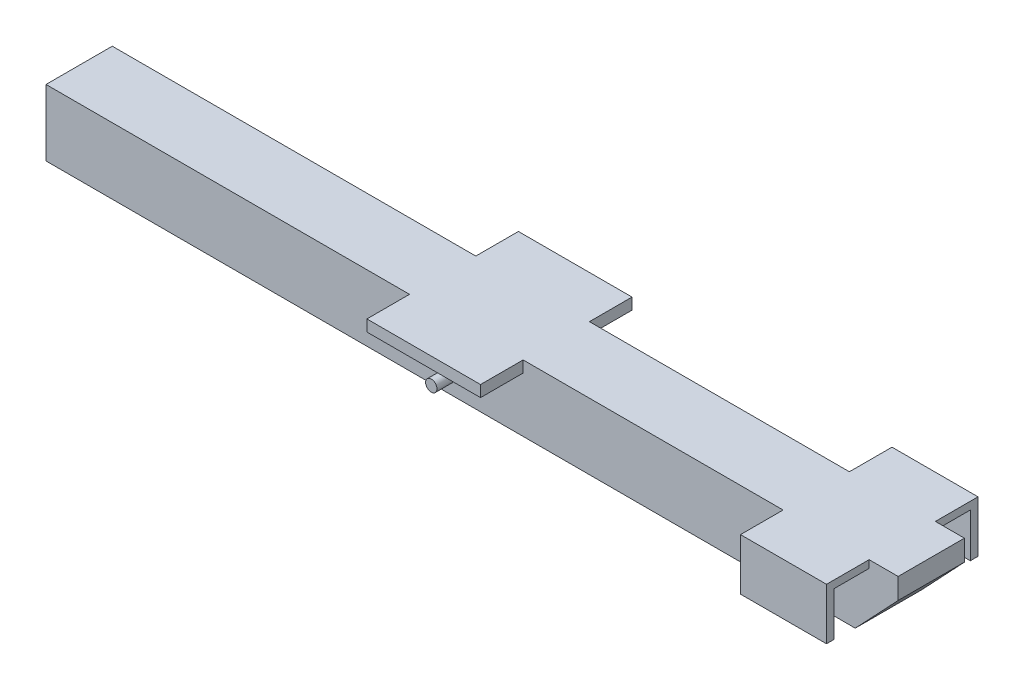
ISO-10303-21;
HEADER;
FILE_DESCRIPTION(('STEP AP214'),'2;1');
FILE_NAME('part.step','',(''),(''),'','','');
FILE_SCHEMA(('AUTOMOTIVE_DESIGN { 1 0 10303 214 1 1 1 1 }'));
ENDSEC;
DATA;
#1=APPLICATION_CONTEXT('core data for automotive mechanical design processes');
#2=APPLICATION_PROTOCOL_DEFINITION('international standard','automotive_design',2000,#1);
#3=PRODUCT_CONTEXT('',#1,'mechanical');
#4=PRODUCT('Part','Part','',(#3));
#5=PRODUCT_RELATED_PRODUCT_CATEGORY('part','',(#4));
#6=PRODUCT_DEFINITION_FORMATION('','',#4);
#7=PRODUCT_DEFINITION_CONTEXT('part definition',#1,'design');
#8=PRODUCT_DEFINITION('design','',#6,#7);
#9=PRODUCT_DEFINITION_SHAPE('','',#8);
#10=(LENGTH_UNIT() NAMED_UNIT(*) SI_UNIT(.MILLI.,.METRE.));
#11=(NAMED_UNIT(*) PLANE_ANGLE_UNIT() SI_UNIT($,.RADIAN.));
#12=(NAMED_UNIT(*) SI_UNIT($,.STERADIAN.) SOLID_ANGLE_UNIT());
#13=UNCERTAINTY_MEASURE_WITH_UNIT(LENGTH_MEASURE(1.E-05),#10,'distance_accuracy_value','');
#14=(GEOMETRIC_REPRESENTATION_CONTEXT(3) GLOBAL_UNCERTAINTY_ASSIGNED_CONTEXT((#13)) GLOBAL_UNIT_ASSIGNED_CONTEXT((#10,
#11,#12)) REPRESENTATION_CONTEXT('',''));
#15=CARTESIAN_POINT('',(0.,0.,0.));
#16=DIRECTION('',(0.,0.,1.));
#17=DIRECTION('',(1.,0.,0.));
#18=AXIS2_PLACEMENT_3D('',#15,#16,#17);
#19=CARTESIAN_POINT('',(11430.,609.6,889.));
#20=DIRECTION('',(-0.727272727272728,0.686348585024613,0.));
#21=DIRECTION('',(-0.686348585024613,-0.727272727272728,0.));
#22=AXIS2_PLACEMENT_3D('',#19,#20,#21);
#23=PLANE('',#22);
#24=DIRECTION('',(0.686348585024613,0.727272727272728,0.));
#25=VECTOR('',#24,1.);
#26=CARTESIAN_POINT('',(11430.,609.6,0.));
#27=LINE('',#26,#25);
#28=CARTESIAN_POINT('',(10854.7026160324,0.,0.));
#29=VERTEX_POINT('',#28);
#30=CARTESIAN_POINT('',(11430.,609.6,0.));
#31=VERTEX_POINT('',#30);
#32=EDGE_CURVE('E394',#29,#31,#27,.T.);
#33=ORIENTED_EDGE('',*,*,#32,.T.);
#34=DIRECTION('',(0.,0.,-1.));
#35=VECTOR('',#34,1.);
#36=CARTESIAN_POINT('',(11430.,609.6,889.));
#37=LINE('',#36,#35);
#38=CARTESIAN_POINT('',(11430.,609.6,889.));
#39=VERTEX_POINT('',#38);
#40=EDGE_CURVE('E432',#39,#31,#37,.T.);
#41=ORIENTED_EDGE('',*,*,#40,.F.);
#42=DIRECTION('',(0.686348585024613,0.727272727272728,0.));
#43=VECTOR('',#42,1.);
#44=CARTESIAN_POINT('',(11430.,609.6,889.));
#45=LINE('',#44,#43);
#46=CARTESIAN_POINT('',(10854.7026160324,0.,889.));
#47=VERTEX_POINT('',#46);
#48=EDGE_CURVE('E395',#47,#39,#45,.T.);
#49=ORIENTED_EDGE('',*,*,#48,.F.);
#50=DIRECTION('',(0.,0.,-1.));
#51=VECTOR('',#50,1.);
#52=CARTESIAN_POINT('',(10854.7026160324,0.,889.));
#53=LINE('',#52,#51);
#54=EDGE_CURVE('E409',#47,#29,#53,.T.);
#55=ORIENTED_EDGE('',*,*,#54,.T.);
#56=EDGE_LOOP('',(#33,#41,#49,#55));
#57=FACE_BOUND('',#56,.T.);
#58=ADVANCED_FACE('F33',(#57),#23,.F.);
#59=CARTESIAN_POINT('',(11430.,889.,889.));
#60=DIRECTION('',(-1.,0.,0.));
#61=DIRECTION('',(0.,0.,1.));
#62=AXIS2_PLACEMENT_3D('',#59,#60,#61);
#63=PLANE('',#62);
#64=DIRECTION('',(0.,1.,0.));
#65=VECTOR('',#64,1.);
#66=CARTESIAN_POINT('',(11430.,889.,0.));
#67=LINE('',#66,#65);
#68=CARTESIAN_POINT('',(11430.,889.,0.));
#69=VERTEX_POINT('',#68);
#70=EDGE_CURVE('E411',#31,#69,#67,.T.);
#71=ORIENTED_EDGE('',*,*,#70,.T.);
#72=DIRECTION('',(0.,0.,-1.));
#73=VECTOR('',#72,1.);
#74=CARTESIAN_POINT('',(11430.,889.,889.));
#75=LINE('',#74,#73);
#76=CARTESIAN_POINT('',(11430.,889.,889.));
#77=VERTEX_POINT('',#76);
#78=EDGE_CURVE('E429',#77,#69,#75,.T.);
#79=ORIENTED_EDGE('',*,*,#78,.F.);
#80=DIRECTION('',(0.,1.,0.));
#81=VECTOR('',#80,1.);
#82=CARTESIAN_POINT('',(11430.,889.,889.));
#83=LINE('',#82,#81);
#84=EDGE_CURVE('E397',#39,#77,#83,.T.);
#85=ORIENTED_EDGE('',*,*,#84,.F.);
#86=ORIENTED_EDGE('',*,*,#40,.T.);
#87=EDGE_LOOP('',(#71,#79,#85,#86));
#88=FACE_BOUND('',#87,.T.);
#89=ADVANCED_FACE('F478',(#88),#63,.F.);
#90=CARTESIAN_POINT('',(0.,889.,889.));
#91=DIRECTION('',(0.,-1.,0.));
#92=DIRECTION('',(0.,0.,-1.));
#93=AXIS2_PLACEMENT_3D('',#90,#91,#92);
#94=PLANE('',#93);
#95=DIRECTION('',(-1.,0.,0.));
#96=VECTOR('',#95,1.);
#97=CARTESIAN_POINT('',(0.,889.,889.));
#98=LINE('',#97,#96);
#99=CARTESIAN_POINT('',(4875.98464352882,888.999999999999,889.));
#100=VERTEX_POINT('',#99);
#101=CARTESIAN_POINT('',(0.,889.,889.));
#102=VERTEX_POINT('',#101);
#103=EDGE_CURVE('E400',#100,#102,#98,.T.);
#104=ORIENTED_EDGE('',*,*,#103,.F.);
#105=DIRECTION('',(0.,0.,1.));
#106=VECTOR('',#105,1.);
#107=CARTESIAN_POINT('',(4875.98464352882,888.999999999999,-571.5));
#108=LINE('',#107,#106);
#109=CARTESIAN_POINT('',(4875.98464352882,888.999999999999,1460.5));
#110=VERTEX_POINT('',#109);
#111=EDGE_CURVE('E339',#100,#110,#108,.T.);
#112=ORIENTED_EDGE('',*,*,#111,.T.);
#113=DIRECTION('',(-1.,0.,0.));
#114=VECTOR('',#113,1.);
#115=CARTESIAN_POINT('',(6399.98464352881,889.,1460.5));
#116=LINE('',#115,#114);
#117=CARTESIAN_POINT('',(6399.98464352881,889.,1460.5));
#118=VERTEX_POINT('',#117);
#119=EDGE_CURVE('E306',#118,#110,#116,.T.);
#120=ORIENTED_EDGE('',*,*,#119,.F.);
#121=DIRECTION('',(0.,0.,1.));
#122=VECTOR('',#121,1.);
#123=CARTESIAN_POINT('',(6399.98464352881,889.,-571.5));
#124=LINE('',#123,#122);
#125=CARTESIAN_POINT('',(6399.98464352881,889.,889.));
#126=VERTEX_POINT('',#125);
#127=EDGE_CURVE('E327',#126,#118,#124,.T.);
#128=ORIENTED_EDGE('',*,*,#127,.F.);
#129=CARTESIAN_POINT('',(9887.1332373752,889.,889.));
#130=VERTEX_POINT('',#129);
#131=EDGE_CURVE('E405',#130,#126,#98,.T.);
#132=ORIENTED_EDGE('',*,*,#131,.F.);
#133=DIRECTION('',(0.,0.,1.));
#134=VECTOR('',#133,1.);
#135=CARTESIAN_POINT('',(9887.1332373752,889.,-571.5));
#136=LINE('',#135,#134);
#137=CARTESIAN_POINT('',(9887.1332373752,889.,1460.5));
#138=VERTEX_POINT('',#137);
#139=EDGE_CURVE('E386',#130,#138,#136,.T.);
#140=ORIENTED_EDGE('',*,*,#139,.T.);
#141=DIRECTION('',(-1.,0.,0.));
#142=VECTOR('',#141,1.);
#143=CARTESIAN_POINT('',(11040.8360496824,889.,1460.5));
#144=LINE('',#143,#142);
#145=CARTESIAN_POINT('',(11040.8360496824,889.,1460.5));
#146=VERTEX_POINT('',#145);
#147=EDGE_CURVE('E353',#146,#138,#144,.T.);
#148=ORIENTED_EDGE('',*,*,#147,.F.);
#149=DIRECTION('',(0.,0.,1.));
#150=VECTOR('',#149,1.);
#151=CARTESIAN_POINT('',(11040.8360496824,889.,-571.5));
#152=LINE('',#151,#150);
#153=CARTESIAN_POINT('',(11040.8360496824,889.,889.));
#154=VERTEX_POINT('',#153);
#155=EDGE_CURVE('E374',#154,#146,#152,.T.);
#156=ORIENTED_EDGE('',*,*,#155,.F.);
#157=EDGE_CURVE('E401',#77,#154,#98,.T.);
#158=ORIENTED_EDGE('',*,*,#157,.F.);
#159=ORIENTED_EDGE('',*,*,#78,.T.);
#160=DIRECTION('',(-1.,0.,0.));
#161=VECTOR('',#160,1.);
#162=CARTESIAN_POINT('',(0.,889.,0.));
#163=LINE('',#162,#161);
#164=CARTESIAN_POINT('',(11040.8360496824,889.,0.));
#165=VERTEX_POINT('',#164);
#166=EDGE_CURVE('E414',#69,#165,#163,.T.);
#167=ORIENTED_EDGE('',*,*,#166,.T.);
#168=CARTESIAN_POINT('',(11040.8360496824,889.,-571.5));
#169=VERTEX_POINT('',#168);
#170=EDGE_CURVE('E387',#169,#165,#152,.T.);
#171=ORIENTED_EDGE('',*,*,#170,.F.);
#172=DIRECTION('',(-1.,0.,0.));
#173=VECTOR('',#172,1.);
#174=CARTESIAN_POINT('',(11040.8360496824,889.,-571.5));
#175=LINE('',#174,#173);
#176=CARTESIAN_POINT('',(9887.1332373752,889.,-571.5));
#177=VERTEX_POINT('',#176);
#178=EDGE_CURVE('E365',#169,#177,#175,.T.);
#179=ORIENTED_EDGE('',*,*,#178,.T.);
#180=CARTESIAN_POINT('',(9887.1332373752,889.,0.));
#181=VERTEX_POINT('',#180);
#182=EDGE_CURVE('E384',#177,#181,#136,.T.);
#183=ORIENTED_EDGE('',*,*,#182,.T.);
#184=CARTESIAN_POINT('',(6399.98464352881,889.,0.));
#185=VERTEX_POINT('',#184);
#186=EDGE_CURVE('E418',#181,#185,#163,.T.);
#187=ORIENTED_EDGE('',*,*,#186,.T.);
#188=CARTESIAN_POINT('',(6399.98464352881,889.,-571.5));
#189=VERTEX_POINT('',#188);
#190=EDGE_CURVE('E340',#189,#185,#124,.T.);
#191=ORIENTED_EDGE('',*,*,#190,.F.);
#192=DIRECTION('',(-1.,0.,0.));
#193=VECTOR('',#192,1.);
#194=CARTESIAN_POINT('',(6399.98464352881,889.,-571.5));
#195=LINE('',#194,#193);
#196=CARTESIAN_POINT('',(4875.98464352882,888.999999999999,-571.5));
#197=VERTEX_POINT('',#196);
#198=EDGE_CURVE('E318',#189,#197,#195,.T.);
#199=ORIENTED_EDGE('',*,*,#198,.T.);
#200=CARTESIAN_POINT('',(4875.98464352882,889.,0.));
#201=VERTEX_POINT('',#200);
#202=EDGE_CURVE('E337',#197,#201,#108,.T.);
#203=ORIENTED_EDGE('',*,*,#202,.T.);
#204=CARTESIAN_POINT('',(0.,889.,0.));
#205=VERTEX_POINT('',#204);
#206=EDGE_CURVE('E413',#201,#205,#163,.T.);
#207=ORIENTED_EDGE('',*,*,#206,.T.);
#208=DIRECTION('',(0.,0.,-1.));
#209=VECTOR('',#208,1.);
#210=CARTESIAN_POINT('',(0.,889.,889.));
#211=LINE('',#210,#209);
#212=EDGE_CURVE('E426',#102,#205,#211,.T.);
#213=ORIENTED_EDGE('',*,*,#212,.F.);
#214=EDGE_LOOP('',(#104,#112,#120,#128,#132,#140,#148,#156,#158,#159,#167,#171,#179,#183,#187,
#191,#199,#203,#207,#213));
#215=FACE_BOUND('',#214,.T.);
#216=ADVANCED_FACE('F452',(#215),#94,.F.);
#217=CARTESIAN_POINT('',(0.,889.,889.));
#218=DIRECTION('',(1.,0.,0.));
#219=DIRECTION('',(0.,0.,-1.));
#220=AXIS2_PLACEMENT_3D('',#217,#218,#219);
#221=PLANE('',#220);
#222=DIRECTION('',(0.,0.,1.));
#223=VECTOR('',#222,1.);
#224=CARTESIAN_POINT('',(0.,76.1999999999996,76.2000000000001));
#225=LINE('',#224,#223);
#226=CARTESIAN_POINT('',(0.,76.1999999999996,76.2000000000002));
#227=VERTEX_POINT('',#226);
#228=CARTESIAN_POINT('',(0.,76.2000000000004,812.8));
#229=VERTEX_POINT('',#228);
#230=EDGE_CURVE('E254',#227,#229,#225,.T.);
#231=ORIENTED_EDGE('',*,*,#230,.F.);
#232=DIRECTION('',(0.,-1.,0.));
#233=VECTOR('',#232,1.);
#234=CARTESIAN_POINT('',(2.368475785867E-13,812.8,76.2));
#235=LINE('',#234,#233);
#236=CARTESIAN_POINT('',(2.368475785867E-13,812.8,76.2));
#237=VERTEX_POINT('',#236);
#238=EDGE_CURVE('E49',#237,#227,#235,.T.);
#239=ORIENTED_EDGE('',*,*,#238,.F.);
#240=DIRECTION('',(0.,0.,-1.));
#241=VECTOR('',#240,1.);
#242=CARTESIAN_POINT('',(2.368475785867E-13,812.8,76.2));
#243=LINE('',#242,#241);
#244=CARTESIAN_POINT('',(2.368475785867E-13,812.8,812.8));
#245=VERTEX_POINT('',#244);
#246=EDGE_CURVE('E245',#245,#237,#243,.T.);
#247=ORIENTED_EDGE('',*,*,#246,.F.);
#248=DIRECTION('',(0.,1.,0.));
#249=VECTOR('',#248,1.);
#250=CARTESIAN_POINT('',(2.368475785867E-13,812.8,812.8));
#251=LINE('',#250,#249);
#252=EDGE_CURVE('E248',#229,#245,#251,.T.);
#253=ORIENTED_EDGE('',*,*,#252,.F.);
#254=EDGE_LOOP('',(#231,#239,#247,#253));
#255=FACE_BOUND('',#254,.T.);
#256=DIRECTION('',(0.,-1.,0.));
#257=VECTOR('',#256,1.);
#258=CARTESIAN_POINT('',(0.,889.,0.));
#259=LINE('',#258,#257);
#260=CARTESIAN_POINT('',(0.,0.,0.));
#261=VERTEX_POINT('',#260);
#262=EDGE_CURVE('E417',#205,#261,#259,.T.);
#263=ORIENTED_EDGE('',*,*,#262,.T.);
#264=DIRECTION('',(0.,0.,-1.));
#265=VECTOR('',#264,1.);
#266=CARTESIAN_POINT('',(0.,0.,889.));
#267=LINE('',#266,#265);
#268=CARTESIAN_POINT('',(0.,0.,889.));
#269=VERTEX_POINT('',#268);
#270=EDGE_CURVE('E423',#269,#261,#267,.T.);
#271=ORIENTED_EDGE('',*,*,#270,.F.);
#272=DIRECTION('',(0.,-1.,0.));
#273=VECTOR('',#272,1.);
#274=CARTESIAN_POINT('',(0.,889.,889.));
#275=LINE('',#274,#273);
#276=EDGE_CURVE('E404',#102,#269,#275,.T.);
#277=ORIENTED_EDGE('',*,*,#276,.F.);
#278=ORIENTED_EDGE('',*,*,#212,.T.);
#279=EDGE_LOOP('',(#263,#271,#277,#278));
#280=FACE_BOUND('',#279,.T.);
#281=ADVANCED_FACE('F461',(#255,#280),#221,.F.);
#282=CARTESIAN_POINT('',(0.,0.,889.));
#283=DIRECTION('',(0.,1.,0.));
#284=DIRECTION('',(0.,0.,1.));
#285=AXIS2_PLACEMENT_3D('',#282,#283,#284);
#286=PLANE('',#285);
#287=DIRECTION('',(1.,0.,0.));
#288=VECTOR('',#287,1.);
#289=CARTESIAN_POINT('',(0.,0.,0.));
#290=LINE('',#289,#288);
#291=EDGE_CURVE('E398',#261,#29,#290,.T.);
#292=ORIENTED_EDGE('',*,*,#291,.T.);
#293=ORIENTED_EDGE('',*,*,#54,.F.);
#294=DIRECTION('',(1.,0.,0.));
#295=VECTOR('',#294,1.);
#296=CARTESIAN_POINT('',(0.,0.,889.));
#297=LINE('',#296,#295);
#298=EDGE_CURVE('E407',#269,#47,#297,.T.);
#299=ORIENTED_EDGE('',*,*,#298,.F.);
#300=ORIENTED_EDGE('',*,*,#270,.T.);
#301=EDGE_LOOP('',(#292,#293,#299,#300));
#302=FACE_BOUND('',#301,.T.);
#303=ADVANCED_FACE('F468',(#302),#286,.F.);
#304=CARTESIAN_POINT('',(0.,0.,889.));
#305=DIRECTION('',(0.,0.,1.));
#306=DIRECTION('',(1.,0.,0.));
#307=AXIS2_PLACEMENT_3D('',#304,#305,#306);
#308=PLANE('',#307);
#309=CARTESIAN_POINT('',(5637.98464352881,444.5,889.));
#310=DIRECTION('',(0.,0.,1.));
#311=DIRECTION('',(1.,0.,0.));
#312=AXIS2_PLACEMENT_3D('',#309,#310,#311);
#313=CIRCLE('',#312,76.2000000000002);
#314=CARTESIAN_POINT('',(5714.18464352881,444.5,889.));
#315=VERTEX_POINT('',#314);
#316=EDGE_CURVE('E11',#315,#315,#313,.T.);
#317=ORIENTED_EDGE('',*,*,#316,.F.);
#318=EDGE_LOOP('',(#317));
#319=FACE_BOUND('',#318,.T.);
#320=ORIENTED_EDGE('',*,*,#48,.T.);
#321=ORIENTED_EDGE('',*,*,#84,.T.);
#322=ORIENTED_EDGE('',*,*,#157,.T.);
#323=DIRECTION('',(0.,1.,0.));
#324=VECTOR('',#323,1.);
#325=CARTESIAN_POINT('',(11040.8360496824,0.,889.));
#326=LINE('',#325,#324);
#327=CARTESIAN_POINT('',(11040.8360496824,787.4,889.));
#328=VERTEX_POINT('',#327);
#329=EDGE_CURVE('E392',#328,#154,#326,.T.);
#330=ORIENTED_EDGE('',*,*,#329,.F.);
#331=DIRECTION('',(1.,0.,0.));
#332=VECTOR('',#331,1.);
#333=CARTESIAN_POINT('',(-0.0009999999992516,787.4,889.));
#334=LINE('',#333,#332);
#335=CARTESIAN_POINT('',(9887.1332373752,787.4,889.));
#336=VERTEX_POINT('',#335);
#337=EDGE_CURVE('E285',#336,#328,#334,.T.);
#338=ORIENTED_EDGE('',*,*,#337,.F.);
#339=DIRECTION('',(0.,-1.,0.));
#340=VECTOR('',#339,1.);
#341=CARTESIAN_POINT('',(9887.1332373752,0.,889.));
#342=LINE('',#341,#340);
#343=EDGE_CURVE('E378',#130,#336,#342,.T.);
#344=ORIENTED_EDGE('',*,*,#343,.F.);
#345=ORIENTED_EDGE('',*,*,#131,.T.);
#346=DIRECTION('',(0.,1.,0.));
#347=VECTOR('',#346,1.);
#348=CARTESIAN_POINT('',(6399.98464352882,7.45974835537336E-11,889.));
#349=LINE('',#348,#347);
#350=CARTESIAN_POINT('',(6399.98464352882,736.6,889.));
#351=VERTEX_POINT('',#350);
#352=EDGE_CURVE('E347',#351,#126,#349,.T.);
#353=ORIENTED_EDGE('',*,*,#352,.F.);
#354=DIRECTION('',(1.,0.,0.));
#355=VECTOR('',#354,1.);
#356=CARTESIAN_POINT('',(0.,736.6,889.));
#357=LINE('',#356,#355);
#358=CARTESIAN_POINT('',(4875.98464352881,736.6,889.));
#359=VERTEX_POINT('',#358);
#360=EDGE_CURVE('E344',#359,#351,#357,.T.);
#361=ORIENTED_EDGE('',*,*,#360,.F.);
#362=DIRECTION('',(0.,-1.,0.));
#363=VECTOR('',#362,1.);
#364=CARTESIAN_POINT('',(4875.98464352881,-2.84169575798655E-11,889.));
#365=LINE('',#364,#363);
#366=EDGE_CURVE('E331',#100,#359,#365,.T.);
#367=ORIENTED_EDGE('',*,*,#366,.F.);
#368=ORIENTED_EDGE('',*,*,#103,.T.);
#369=ORIENTED_EDGE('',*,*,#276,.T.);
#370=ORIENTED_EDGE('',*,*,#298,.T.);
#371=EDGE_LOOP('',(#320,#321,#322,#330,#338,#344,#345,#353,#361,#367,#368,#369,#370));
#372=FACE_BOUND('',#371,.T.);
#373=ADVANCED_FACE('F475',(#319,#372),#308,.T.);
#374=CARTESIAN_POINT('',(0.,0.,0.));
#375=DIRECTION('',(0.,0.,1.));
#376=DIRECTION('',(1.,0.,0.));
#377=AXIS2_PLACEMENT_3D('',#374,#375,#376);
#378=PLANE('',#377);
#379=CARTESIAN_POINT('',(5637.98464352881,444.5,0.));
#380=DIRECTION('',(0.,0.,1.));
#381=DIRECTION('',(1.,0.,0.));
#382=AXIS2_PLACEMENT_3D('',#379,#380,#381);
#383=CIRCLE('',#382,76.2000000000002);
#384=CARTESIAN_POINT('',(5714.18464352881,444.5,0.));
#385=VERTEX_POINT('',#384);
#386=EDGE_CURVE('E36',#385,#385,#383,.T.);
#387=ORIENTED_EDGE('',*,*,#386,.T.);
#388=EDGE_LOOP('',(#387));
#389=FACE_BOUND('',#388,.T.);
#390=DIRECTION('',(1.,0.,0.));
#391=VECTOR('',#390,1.);
#392=CARTESIAN_POINT('',(0.,736.6,0.));
#393=LINE('',#392,#391);
#394=CARTESIAN_POINT('',(4875.98464352881,736.6,0.));
#395=VERTEX_POINT('',#394);
#396=CARTESIAN_POINT('',(6399.98464352882,736.6,0.));
#397=VERTEX_POINT('',#396);
#398=EDGE_CURVE('E443',#395,#397,#393,.T.);
#399=ORIENTED_EDGE('',*,*,#398,.T.);
#400=DIRECTION('',(0.,1.,0.));
#401=VECTOR('',#400,1.);
#402=CARTESIAN_POINT('',(6399.98464352882,7.45974835537336E-11,0.));
#403=LINE('',#402,#401);
#404=EDGE_CURVE('E41',#397,#185,#403,.T.);
#405=ORIENTED_EDGE('',*,*,#404,.T.);
#406=ORIENTED_EDGE('',*,*,#186,.F.);
#407=DIRECTION('',(0.,-1.,0.));
#408=VECTOR('',#407,1.);
#409=CARTESIAN_POINT('',(9887.1332373752,0.,0.));
#410=LINE('',#409,#408);
#411=CARTESIAN_POINT('',(9887.1332373752,787.4,0.));
#412=VERTEX_POINT('',#411);
#413=EDGE_CURVE('E435',#181,#412,#410,.T.);
#414=ORIENTED_EDGE('',*,*,#413,.T.);
#415=DIRECTION('',(1.,0.,0.));
#416=VECTOR('',#415,1.);
#417=CARTESIAN_POINT('',(-0.0009999999992516,787.4,0.));
#418=LINE('',#417,#416);
#419=CARTESIAN_POINT('',(11040.8360496824,787.4,0.));
#420=VERTEX_POINT('',#419);
#421=EDGE_CURVE('E288',#412,#420,#418,.T.);
#422=ORIENTED_EDGE('',*,*,#421,.T.);
#423=DIRECTION('',(0.,1.,0.));
#424=VECTOR('',#423,1.);
#425=CARTESIAN_POINT('',(11040.8360496824,0.,0.));
#426=LINE('',#425,#424);
#427=EDGE_CURVE('E438',#420,#165,#426,.T.);
#428=ORIENTED_EDGE('',*,*,#427,.T.);
#429=ORIENTED_EDGE('',*,*,#166,.F.);
#430=ORIENTED_EDGE('',*,*,#70,.F.);
#431=ORIENTED_EDGE('',*,*,#32,.F.);
#432=ORIENTED_EDGE('',*,*,#291,.F.);
#433=ORIENTED_EDGE('',*,*,#262,.F.);
#434=ORIENTED_EDGE('',*,*,#206,.F.);
#435=DIRECTION('',(0.,-1.,0.));
#436=VECTOR('',#435,1.);
#437=CARTESIAN_POINT('',(4875.98464352881,-2.84169575798655E-11,0.));
#438=LINE('',#437,#436);
#439=EDGE_CURVE('E440',#201,#395,#438,.T.);
#440=ORIENTED_EDGE('',*,*,#439,.T.);
#441=EDGE_LOOP('',(#399,#405,#406,#414,#422,#428,#429,#430,#431,#432,#433,#434,#440));
#442=FACE_BOUND('',#441,.T.);
#443=ADVANCED_FACE('F449',(#389,#442),#378,.F.);
#444=CARTESIAN_POINT('',(0.,0.,-571.5));
#445=DIRECTION('',(0.,0.,-1.));
#446=DIRECTION('',(-1.,0.,0.));
#447=AXIS2_PLACEMENT_3D('',#444,#445,#446);
#448=PLANE('',#447);
#449=DIRECTION('',(0.,1.,0.));
#450=VECTOR('',#449,1.);
#451=CARTESIAN_POINT('',(11040.8360496824,889.,-571.5));
#452=LINE('',#451,#450);
#453=CARTESIAN_POINT('',(11040.8360496824,197.231804480895,-571.5));
#454=VERTEX_POINT('',#453);
#455=EDGE_CURVE('E362',#454,#169,#452,.T.);
#456=ORIENTED_EDGE('',*,*,#455,.F.);
#457=DIRECTION('',(1.,0.,0.));
#458=VECTOR('',#457,1.);
#459=CARTESIAN_POINT('',(11040.8360496824,197.231804480895,-571.5));
#460=LINE('',#459,#458);
#461=CARTESIAN_POINT('',(9887.1332373752,197.231804480895,-571.5));
#462=VERTEX_POINT('',#461);
#463=EDGE_CURVE('E371',#462,#454,#460,.T.);
#464=ORIENTED_EDGE('',*,*,#463,.F.);
#465=DIRECTION('',(0.,-1.,0.));
#466=VECTOR('',#465,1.);
#467=CARTESIAN_POINT('',(9887.1332373752,889.,-571.5));
#468=LINE('',#467,#466);
#469=EDGE_CURVE('E368',#177,#462,#468,.T.);
#470=ORIENTED_EDGE('',*,*,#469,.F.);
#471=ORIENTED_EDGE('',*,*,#178,.F.);
#472=EDGE_LOOP('',(#456,#464,#470,#471));
#473=FACE_BOUND('',#472,.T.);
#474=ADVANCED_FACE('F548',(#473),#448,.T.);
#475=CARTESIAN_POINT('',(9887.1332373752,889.,-571.5));
#476=DIRECTION('',(-1.,0.,0.));
#477=DIRECTION('',(0.,0.,1.));
#478=AXIS2_PLACEMENT_3D('',#475,#476,#477);
#479=PLANE('',#478);
#480=DIRECTION('',(0.,1.,0.));
#481=VECTOR('',#480,1.);
#482=CARTESIAN_POINT('',(9887.1332373752,197.231804480895,-468.477816714797));
#483=LINE('',#482,#481);
#484=CARTESIAN_POINT('',(9887.1332373752,197.231804480895,-468.477816714797));
#485=VERTEX_POINT('',#484);
#486=CARTESIAN_POINT('',(9887.1332373752,787.4,-468.477816714797));
#487=VERTEX_POINT('',#486);
#488=EDGE_CURVE('E289',#485,#487,#483,.T.);
#489=ORIENTED_EDGE('',*,*,#488,.T.);
#490=DIRECTION('',(0.,0.,1.));
#491=VECTOR('',#490,1.);
#492=CARTESIAN_POINT('',(9887.1332373752,787.4,0.));
#493=LINE('',#492,#491);
#494=EDGE_CURVE('E292',#487,#412,#493,.T.);
#495=ORIENTED_EDGE('',*,*,#494,.T.);
#496=ORIENTED_EDGE('',*,*,#413,.F.);
#497=ORIENTED_EDGE('',*,*,#182,.F.);
#498=ORIENTED_EDGE('',*,*,#469,.T.);
#499=DIRECTION('',(0.,0.,1.));
#500=VECTOR('',#499,1.);
#501=CARTESIAN_POINT('',(9887.1332373752,197.231804480895,-571.5));
#502=LINE('',#501,#500);
#503=EDGE_CURVE('E380',#462,#485,#502,.T.);
#504=ORIENTED_EDGE('',*,*,#503,.T.);
#505=EDGE_LOOP('',(#489,#495,#496,#497,#498,#504));
#506=FACE_BOUND('',#505,.T.);
#507=ADVANCED_FACE('F560',(#506),#479,.T.);
#508=CARTESIAN_POINT('',(11040.8360496824,197.231804480895,-571.5));
#509=DIRECTION('',(0.,-1.,0.));
#510=DIRECTION('',(1.,0.,0.));
#511=AXIS2_PLACEMENT_3D('',#508,#509,#510);
#512=PLANE('',#511);
#513=DIRECTION('',(1.,0.,0.));
#514=VECTOR('',#513,1.);
#515=CARTESIAN_POINT('',(-0.0009999999992516,197.231804480895,-468.477816714797));
#516=LINE('',#515,#514);
#517=CARTESIAN_POINT('',(11040.8360496824,197.231804480895,-468.477816714797));
#518=VERTEX_POINT('',#517);
#519=EDGE_CURVE('E299',#485,#518,#516,.T.);
#520=ORIENTED_EDGE('',*,*,#519,.F.);
#521=ORIENTED_EDGE('',*,*,#503,.F.);
#522=ORIENTED_EDGE('',*,*,#463,.T.);
#523=DIRECTION('',(0.,0.,1.));
#524=VECTOR('',#523,1.);
#525=CARTESIAN_POINT('',(11040.8360496824,197.231804480895,-571.5));
#526=LINE('',#525,#524);
#527=EDGE_CURVE('E375',#454,#518,#526,.T.);
#528=ORIENTED_EDGE('',*,*,#527,.T.);
#529=EDGE_LOOP('',(#520,#521,#522,#528));
#530=FACE_BOUND('',#529,.T.);
#531=ADVANCED_FACE('F564',(#530),#512,.T.);
#532=CARTESIAN_POINT('',(11040.8360496824,889.,-571.5));
#533=DIRECTION('',(1.,0.,0.));
#534=DIRECTION('',(0.,0.,-1.));
#535=AXIS2_PLACEMENT_3D('',#532,#533,#534);
#536=PLANE('',#535);
#537=DIRECTION('',(0.,1.,0.));
#538=VECTOR('',#537,1.);
#539=CARTESIAN_POINT('',(11040.8360496824,197.231804480895,-468.477816714797));
#540=LINE('',#539,#538);
#541=CARTESIAN_POINT('',(11040.8360496824,787.4,-468.477816714797));
#542=VERTEX_POINT('',#541);
#543=EDGE_CURVE('E295',#518,#542,#540,.T.);
#544=ORIENTED_EDGE('',*,*,#543,.F.);
#545=ORIENTED_EDGE('',*,*,#527,.F.);
#546=ORIENTED_EDGE('',*,*,#455,.T.);
#547=ORIENTED_EDGE('',*,*,#170,.T.);
#548=ORIENTED_EDGE('',*,*,#427,.F.);
#549=DIRECTION('',(0.,0.,1.));
#550=VECTOR('',#549,1.);
#551=CARTESIAN_POINT('',(11040.8360496824,787.4,0.));
#552=LINE('',#551,#550);
#553=EDGE_CURVE('E57',#542,#420,#552,.T.);
#554=ORIENTED_EDGE('',*,*,#553,.F.);
#555=EDGE_LOOP('',(#544,#545,#546,#547,#548,#554));
#556=FACE_BOUND('',#555,.T.);
#557=ADVANCED_FACE('F556',(#556),#536,.T.);
#558=DIRECTION('',(0.,-1.,0.));
#559=VECTOR('',#558,1.);
#560=CARTESIAN_POINT('',(11040.8360496824,197.231804480895,1357.4778167148));
#561=LINE('',#560,#559);
#562=CARTESIAN_POINT('',(11040.8360496824,787.4,1357.4778167148));
#563=VERTEX_POINT('',#562);
#564=CARTESIAN_POINT('',(11040.8360496824,197.231804480895,1357.4778167148));
#565=VERTEX_POINT('',#564);
#566=EDGE_CURVE('E277',#563,#565,#561,.T.);
#567=ORIENTED_EDGE('',*,*,#566,.F.);
#568=DIRECTION('',(0.,0.,1.));
#569=VECTOR('',#568,1.);
#570=CARTESIAN_POINT('',(11040.8360496824,787.4,889.));
#571=LINE('',#570,#569);
#572=EDGE_CURVE('E280',#328,#563,#571,.T.);
#573=ORIENTED_EDGE('',*,*,#572,.F.);
#574=ORIENTED_EDGE('',*,*,#329,.T.);
#575=ORIENTED_EDGE('',*,*,#155,.T.);
#576=DIRECTION('',(0.,1.,0.));
#577=VECTOR('',#576,1.);
#578=CARTESIAN_POINT('',(11040.8360496824,889.,1460.5));
#579=LINE('',#578,#577);
#580=CARTESIAN_POINT('',(11040.8360496824,197.231804480895,1460.5));
#581=VERTEX_POINT('',#580);
#582=EDGE_CURVE('E350',#581,#146,#579,.T.);
#583=ORIENTED_EDGE('',*,*,#582,.F.);
#584=EDGE_CURVE('E379',#565,#581,#526,.T.);
#585=ORIENTED_EDGE('',*,*,#584,.F.);
#586=EDGE_LOOP('',(#567,#573,#574,#575,#583,#585));
#587=FACE_BOUND('',#586,.T.);
#588=ADVANCED_FACE('F489',(#587),#536,.T.);
#589=DIRECTION('',(1.,0.,0.));
#590=VECTOR('',#589,1.);
#591=CARTESIAN_POINT('',(-0.0009999999992516,197.231804480895,1357.4778167148));
#592=LINE('',#591,#590);
#593=CARTESIAN_POINT('',(9887.1332373752,197.231804480895,1357.4778167148));
#594=VERTEX_POINT('',#593);
#595=EDGE_CURVE('E273',#594,#565,#592,.T.);
#596=ORIENTED_EDGE('',*,*,#595,.T.);
#597=ORIENTED_EDGE('',*,*,#584,.T.);
#598=DIRECTION('',(1.,0.,0.));
#599=VECTOR('',#598,1.);
#600=CARTESIAN_POINT('',(11040.8360496824,197.231804480895,1460.5));
#601=LINE('',#600,#599);
#602=CARTESIAN_POINT('',(9887.1332373752,197.231804480895,1460.5));
#603=VERTEX_POINT('',#602);
#604=EDGE_CURVE('E359',#603,#581,#601,.T.);
#605=ORIENTED_EDGE('',*,*,#604,.F.);
#606=EDGE_CURVE('E383',#594,#603,#502,.T.);
#607=ORIENTED_EDGE('',*,*,#606,.F.);
#608=EDGE_LOOP('',(#596,#597,#605,#607));
#609=FACE_BOUND('',#608,.T.);
#610=ADVANCED_FACE('F555',(#609),#512,.T.);
#611=DIRECTION('',(0.,-1.,0.));
#612=VECTOR('',#611,1.);
#613=CARTESIAN_POINT('',(9887.1332373752,197.231804480895,1357.4778167148));
#614=LINE('',#613,#612);
#615=CARTESIAN_POINT('',(9887.1332373752,787.4,1357.4778167148));
#616=VERTEX_POINT('',#615);
#617=EDGE_CURVE('E276',#616,#594,#614,.T.);
#618=ORIENTED_EDGE('',*,*,#617,.T.);
#619=ORIENTED_EDGE('',*,*,#606,.T.);
#620=DIRECTION('',(0.,-1.,0.));
#621=VECTOR('',#620,1.);
#622=CARTESIAN_POINT('',(9887.1332373752,889.,1460.5));
#623=LINE('',#622,#621);
#624=EDGE_CURVE('E356',#138,#603,#623,.T.);
#625=ORIENTED_EDGE('',*,*,#624,.F.);
#626=ORIENTED_EDGE('',*,*,#139,.F.);
#627=ORIENTED_EDGE('',*,*,#343,.T.);
#628=DIRECTION('',(0.,0.,1.));
#629=VECTOR('',#628,1.);
#630=CARTESIAN_POINT('',(9887.1332373752,787.4,889.));
#631=LINE('',#630,#629);
#632=EDGE_CURVE('E269',#336,#616,#631,.T.);
#633=ORIENTED_EDGE('',*,*,#632,.T.);
#634=EDGE_LOOP('',(#618,#619,#625,#626,#627,#633));
#635=FACE_BOUND('',#634,.T.);
#636=ADVANCED_FACE('F496',(#635),#479,.T.);
#637=CARTESIAN_POINT('',(0.,0.,1460.5));
#638=DIRECTION('',(0.,0.,-1.));
#639=DIRECTION('',(-1.,0.,0.));
#640=AXIS2_PLACEMENT_3D('',#637,#638,#639);
#641=PLANE('',#640);
#642=ORIENTED_EDGE('',*,*,#582,.T.);
#643=ORIENTED_EDGE('',*,*,#147,.T.);
#644=ORIENTED_EDGE('',*,*,#624,.T.);
#645=ORIENTED_EDGE('',*,*,#604,.T.);
#646=EDGE_LOOP('',(#642,#643,#644,#645));
#647=FACE_BOUND('',#646,.T.);
#648=ADVANCED_FACE('F559',(#647),#641,.F.);
#649=CARTESIAN_POINT('',(0.,0.,-571.5));
#650=DIRECTION('',(0.,0.,-1.));
#651=DIRECTION('',(-1.,0.,0.));
#652=AXIS2_PLACEMENT_3D('',#649,#650,#651);
#653=PLANE('',#652);
#654=DIRECTION('',(0.,1.,0.));
#655=VECTOR('',#654,1.);
#656=CARTESIAN_POINT('',(6399.98464352881,889.,-571.5));
#657=LINE('',#656,#655);
#658=CARTESIAN_POINT('',(6399.98464352882,736.6,-571.5));
#659=VERTEX_POINT('',#658);
#660=EDGE_CURVE('E315',#659,#189,#657,.T.);
#661=ORIENTED_EDGE('',*,*,#660,.F.);
#662=DIRECTION('',(1.,0.,0.));
#663=VECTOR('',#662,1.);
#664=CARTESIAN_POINT('',(6399.98464352882,736.6,-571.5));
#665=LINE('',#664,#663);
#666=CARTESIAN_POINT('',(4875.98464352881,736.6,-571.5));
#667=VERTEX_POINT('',#666);
#668=EDGE_CURVE('E324',#667,#659,#665,.T.);
#669=ORIENTED_EDGE('',*,*,#668,.F.);
#670=DIRECTION('',(0.,-1.,0.));
#671=VECTOR('',#670,1.);
#672=CARTESIAN_POINT('',(4875.98464352882,888.999999999999,-571.5));
#673=LINE('',#672,#671);
#674=EDGE_CURVE('E321',#197,#667,#673,.T.);
#675=ORIENTED_EDGE('',*,*,#674,.F.);
#676=ORIENTED_EDGE('',*,*,#198,.F.);
#677=EDGE_LOOP('',(#661,#669,#675,#676));
#678=FACE_BOUND('',#677,.T.);
#679=ADVANCED_FACE('F530',(#678),#653,.T.);
#680=CARTESIAN_POINT('',(4875.98464352882,888.999999999999,-571.5));
#681=DIRECTION('',(-1.,0.,0.));
#682=DIRECTION('',(0.,-1.,0.));
#683=AXIS2_PLACEMENT_3D('',#680,#681,#682);
#684=PLANE('',#683);
#685=ORIENTED_EDGE('',*,*,#439,.F.);
#686=ORIENTED_EDGE('',*,*,#202,.F.);
#687=ORIENTED_EDGE('',*,*,#674,.T.);
#688=DIRECTION('',(0.,0.,1.));
#689=VECTOR('',#688,1.);
#690=CARTESIAN_POINT('',(4875.98464352881,736.6,-571.5));
#691=LINE('',#690,#689);
#692=EDGE_CURVE('E333',#667,#395,#691,.T.);
#693=ORIENTED_EDGE('',*,*,#692,.T.);
#694=EDGE_LOOP('',(#685,#686,#687,#693));
#695=FACE_BOUND('',#694,.T.);
#696=ADVANCED_FACE('F519',(#695),#684,.T.);
#697=CARTESIAN_POINT('',(6399.98464352882,736.6,-571.5));
#698=DIRECTION('',(0.,-1.,0.));
#699=DIRECTION('',(0.,0.,-1.));
#700=AXIS2_PLACEMENT_3D('',#697,#698,#699);
#701=PLANE('',#700);
#702=ORIENTED_EDGE('',*,*,#398,.F.);
#703=ORIENTED_EDGE('',*,*,#692,.F.);
#704=ORIENTED_EDGE('',*,*,#668,.T.);
#705=DIRECTION('',(0.,0.,1.));
#706=VECTOR('',#705,1.);
#707=CARTESIAN_POINT('',(6399.98464352882,736.6,-571.5));
#708=LINE('',#707,#706);
#709=EDGE_CURVE('E328',#659,#397,#708,.T.);
#710=ORIENTED_EDGE('',*,*,#709,.T.);
#711=EDGE_LOOP('',(#702,#703,#704,#710));
#712=FACE_BOUND('',#711,.T.);
#713=ADVANCED_FACE('F527',(#712),#701,.T.);
#714=CARTESIAN_POINT('',(6399.98464352881,889.,-571.5));
#715=DIRECTION('',(1.,0.,0.));
#716=DIRECTION('',(0.,1.,0.));
#717=AXIS2_PLACEMENT_3D('',#714,#715,#716);
#718=PLANE('',#717);
#719=ORIENTED_EDGE('',*,*,#404,.F.);
#720=ORIENTED_EDGE('',*,*,#709,.F.);
#721=ORIENTED_EDGE('',*,*,#660,.T.);
#722=ORIENTED_EDGE('',*,*,#190,.T.);
#723=EDGE_LOOP('',(#719,#720,#721,#722));
#724=FACE_BOUND('',#723,.T.);
#725=ADVANCED_FACE('F571',(#724),#718,.T.);
#726=CARTESIAN_POINT('',(6399.98464352882,736.6,1460.5));
#727=VERTEX_POINT('',#726);
#728=EDGE_CURVE('E332',#351,#727,#708,.T.);
#729=ORIENTED_EDGE('',*,*,#728,.F.);
#730=ORIENTED_EDGE('',*,*,#352,.T.);
#731=ORIENTED_EDGE('',*,*,#127,.T.);
#732=DIRECTION('',(0.,1.,0.));
#733=VECTOR('',#732,1.);
#734=CARTESIAN_POINT('',(6399.98464352881,889.,1460.5));
#735=LINE('',#734,#733);
#736=EDGE_CURVE('E279',#727,#118,#735,.T.);
#737=ORIENTED_EDGE('',*,*,#736,.F.);
#738=EDGE_LOOP('',(#729,#730,#731,#737));
#739=FACE_BOUND('',#738,.T.);
#740=ADVANCED_FACE('F503',(#739),#718,.T.);
#741=CARTESIAN_POINT('',(4875.98464352881,736.6,1460.5));
#742=VERTEX_POINT('',#741);
#743=EDGE_CURVE('E336',#359,#742,#691,.T.);
#744=ORIENTED_EDGE('',*,*,#743,.F.);
#745=ORIENTED_EDGE('',*,*,#360,.T.);
#746=ORIENTED_EDGE('',*,*,#728,.T.);
#747=DIRECTION('',(1.,0.,0.));
#748=VECTOR('',#747,1.);
#749=CARTESIAN_POINT('',(6399.98464352882,736.6,1460.5));
#750=LINE('',#749,#748);
#751=EDGE_CURVE('E312',#742,#727,#750,.T.);
#752=ORIENTED_EDGE('',*,*,#751,.F.);
#753=EDGE_LOOP('',(#744,#745,#746,#752));
#754=FACE_BOUND('',#753,.T.);
#755=ADVANCED_FACE('F513',(#754),#701,.T.);
#756=ORIENTED_EDGE('',*,*,#111,.F.);
#757=ORIENTED_EDGE('',*,*,#366,.T.);
#758=ORIENTED_EDGE('',*,*,#743,.T.);
#759=DIRECTION('',(0.,-1.,0.));
#760=VECTOR('',#759,1.);
#761=CARTESIAN_POINT('',(4875.98464352882,888.999999999999,1460.5));
#762=LINE('',#761,#760);
#763=EDGE_CURVE('E309',#110,#742,#762,.T.);
#764=ORIENTED_EDGE('',*,*,#763,.F.);
#765=EDGE_LOOP('',(#756,#757,#758,#764));
#766=FACE_BOUND('',#765,.T.);
#767=ADVANCED_FACE('F516',(#766),#684,.T.);
#768=CARTESIAN_POINT('',(0.,0.,1460.5));
#769=DIRECTION('',(0.,0.,-1.));
#770=DIRECTION('',(-1.,0.,0.));
#771=AXIS2_PLACEMENT_3D('',#768,#769,#770);
#772=PLANE('',#771);
#773=ORIENTED_EDGE('',*,*,#736,.T.);
#774=ORIENTED_EDGE('',*,*,#119,.T.);
#775=ORIENTED_EDGE('',*,*,#763,.T.);
#776=ORIENTED_EDGE('',*,*,#751,.T.);
#777=EDGE_LOOP('',(#773,#774,#775,#776));
#778=FACE_BOUND('',#777,.T.);
#779=ADVANCED_FACE('F509',(#778),#772,.F.);
#780=CARTESIAN_POINT('',(-0.0009999999992516,197.231804480895,1357.4778167148));
#781=DIRECTION('',(0.,0.,1.));
#782=DIRECTION('',(1.,0.,0.));
#783=AXIS2_PLACEMENT_3D('',#780,#781,#782);
#784=PLANE('',#783);
#785=DIRECTION('',(1.,0.,0.));
#786=VECTOR('',#785,1.);
#787=CARTESIAN_POINT('',(-0.0009999999992516,787.4,1357.4778167148));
#788=LINE('',#787,#786);
#789=EDGE_CURVE('E272',#616,#563,#788,.T.);
#790=ORIENTED_EDGE('',*,*,#789,.T.);
#791=ORIENTED_EDGE('',*,*,#566,.T.);
#792=ORIENTED_EDGE('',*,*,#595,.F.);
#793=ORIENTED_EDGE('',*,*,#617,.F.);
#794=EDGE_LOOP('',(#790,#791,#792,#793));
#795=FACE_BOUND('',#794,.T.);
#796=ADVANCED_FACE('F524',(#795),#784,.F.);
#797=CARTESIAN_POINT('',(-0.0009999999992516,787.4,889.));
#798=DIRECTION('',(0.,1.,0.));
#799=DIRECTION('',(0.,0.,1.));
#800=AXIS2_PLACEMENT_3D('',#797,#798,#799);
#801=PLANE('',#800);
#802=ORIENTED_EDGE('',*,*,#337,.T.);
#803=ORIENTED_EDGE('',*,*,#572,.T.);
#804=ORIENTED_EDGE('',*,*,#789,.F.);
#805=ORIENTED_EDGE('',*,*,#632,.F.);
#806=EDGE_LOOP('',(#802,#803,#804,#805));
#807=FACE_BOUND('',#806,.T.);
#808=ADVANCED_FACE('F493',(#807),#801,.F.);
#809=CARTESIAN_POINT('',(-0.0009999999992516,197.231804480895,-468.477816714797));
#810=DIRECTION('',(0.,0.,-1.));
#811=DIRECTION('',(-1.,0.,0.));
#812=AXIS2_PLACEMENT_3D('',#809,#810,#811);
#813=PLANE('',#812);
#814=ORIENTED_EDGE('',*,*,#519,.T.);
#815=ORIENTED_EDGE('',*,*,#543,.T.);
#816=DIRECTION('',(1.,0.,0.));
#817=VECTOR('',#816,1.);
#818=CARTESIAN_POINT('',(-0.0009999999992516,787.4,-468.477816714797));
#819=LINE('',#818,#817);
#820=EDGE_CURVE('E301',#487,#542,#819,.T.);
#821=ORIENTED_EDGE('',*,*,#820,.F.);
#822=ORIENTED_EDGE('',*,*,#488,.F.);
#823=EDGE_LOOP('',(#814,#815,#821,#822));
#824=FACE_BOUND('',#823,.T.);
#825=ADVANCED_FACE('F585',(#824),#813,.F.);
#826=CARTESIAN_POINT('',(-0.0009999999992516,787.4,0.));
#827=DIRECTION('',(0.,1.,0.));
#828=DIRECTION('',(0.,0.,1.));
#829=AXIS2_PLACEMENT_3D('',#826,#827,#828);
#830=PLANE('',#829);
#831=ORIENTED_EDGE('',*,*,#820,.T.);
#832=ORIENTED_EDGE('',*,*,#553,.T.);
#833=ORIENTED_EDGE('',*,*,#421,.F.);
#834=ORIENTED_EDGE('',*,*,#494,.F.);
#835=EDGE_LOOP('',(#831,#832,#833,#834));
#836=FACE_BOUND('',#835,.T.);
#837=ADVANCED_FACE('F588',(#836),#830,.F.);
#838=CARTESIAN_POINT('',(5637.98464352881,444.5,-469.9));
#839=DIRECTION('',(0.,0.,1.));
#840=DIRECTION('',(1.,0.,0.));
#841=AXIS2_PLACEMENT_3D('',#838,#839,#840);
#842=PLANE('',#841);
#843=CARTESIAN_POINT('',(5637.98464352881,444.5,-469.9));
#844=DIRECTION('',(0.,0.,1.));
#845=DIRECTION('',(1.,0.,0.));
#846=AXIS2_PLACEMENT_3D('',#843,#844,#845);
#847=CIRCLE('',#846,76.2000000000002);
#848=CARTESIAN_POINT('',(5714.18464352881,444.5,-469.9));
#849=VERTEX_POINT('',#848);
#850=EDGE_CURVE('E266',#849,#849,#847,.T.);
#851=ORIENTED_EDGE('',*,*,#850,.F.);
#852=EDGE_LOOP('',(#851));
#853=FACE_BOUND('',#852,.T.);
#854=ADVANCED_FACE('F592',(#853),#842,.F.);
#855=CARTESIAN_POINT('',(5637.98464352881,444.5,-469.9));
#856=DIRECTION('',(0.,0.,1.));
#857=DIRECTION('',(1.,0.,0.));
#858=AXIS2_PLACEMENT_3D('',#855,#856,#857);
#859=CYLINDRICAL_SURFACE('',#858,76.2000000000002);
#860=ORIENTED_EDGE('',*,*,#850,.T.);
#861=EDGE_LOOP('',(#860));
#862=FACE_BOUND('',#861,.T.);
#863=ORIENTED_EDGE('',*,*,#386,.F.);
#864=EDGE_LOOP('',(#863));
#865=FACE_BOUND('',#864,.T.);
#866=ADVANCED_FACE('F602',(#862,#865),#859,.T.);
#867=ORIENTED_EDGE('',*,*,#316,.T.);
#868=EDGE_LOOP('',(#867));
#869=FACE_BOUND('',#868,.T.);
#870=CARTESIAN_POINT('',(5637.98464352881,444.5,1358.9));
#871=DIRECTION('',(0.,0.,1.));
#872=DIRECTION('',(1.,0.,0.));
#873=AXIS2_PLACEMENT_3D('',#870,#871,#872);
#874=CIRCLE('',#873,76.2000000000002);
#875=CARTESIAN_POINT('',(5714.18464352881,444.5,1358.9));
#876=VERTEX_POINT('',#875);
#877=EDGE_CURVE('E260',#876,#876,#874,.T.);
#878=ORIENTED_EDGE('',*,*,#877,.F.);
#879=EDGE_LOOP('',(#878));
#880=FACE_BOUND('',#879,.T.);
#881=ADVANCED_FACE('F598',(#869,#880),#859,.T.);
#882=CARTESIAN_POINT('',(5637.98464352881,444.5,1358.9));
#883=DIRECTION('',(0.,0.,1.));
#884=DIRECTION('',(1.,0.,0.));
#885=AXIS2_PLACEMENT_3D('',#882,#883,#884);
#886=PLANE('',#885);
#887=ORIENTED_EDGE('',*,*,#877,.T.);
#888=EDGE_LOOP('',(#887));
#889=FACE_BOUND('',#888,.T.);
#890=ADVANCED_FACE('F601',(#889),#886,.T.);
#891=CARTESIAN_POINT('',(10551.414,812.799999999997,76.2));
#892=DIRECTION('',(0.,0.,-1.));
#893=DIRECTION('',(0.,1.,0.));
#894=AXIS2_PLACEMENT_3D('',#891,#892,#893);
#895=PLANE('',#894);
#896=ORIENTED_EDGE('',*,*,#238,.T.);
#897=DIRECTION('',(-1.,0.,0.));
#898=VECTOR('',#897,1.);
#899=CARTESIAN_POINT('',(10551.414,76.1999999999965,76.2000000000001));
#900=LINE('',#899,#898);
#901=CARTESIAN_POINT('',(10551.414,76.1999999999965,76.2000000000001));
#902=VERTEX_POINT('',#901);
#903=EDGE_CURVE('E223',#902,#227,#900,.T.);
#904=ORIENTED_EDGE('',*,*,#903,.F.);
#905=DIRECTION('',(0.,-1.,0.));
#906=VECTOR('',#905,1.);
#907=CARTESIAN_POINT('',(10551.414,812.799999999997,76.2));
#908=LINE('',#907,#906);
#909=CARTESIAN_POINT('',(10551.414,812.799999999997,76.2));
#910=VERTEX_POINT('',#909);
#911=EDGE_CURVE('E227',#910,#902,#908,.T.);
#912=ORIENTED_EDGE('',*,*,#911,.F.);
#913=DIRECTION('',(-1.,0.,0.));
#914=VECTOR('',#913,1.);
#915=CARTESIAN_POINT('',(10551.414,812.799999999997,76.2));
#916=LINE('',#915,#914);
#917=EDGE_CURVE('E258',#910,#237,#916,.T.);
#918=ORIENTED_EDGE('',*,*,#917,.T.);
#919=EDGE_LOOP('',(#896,#904,#912,#918));
#920=FACE_BOUND('',#919,.T.);
#921=ADVANCED_FACE('F225',(#920),#895,.F.);
#922=CARTESIAN_POINT('',(10551.414,812.799999999997,76.2));
#923=DIRECTION('',(0.,1.,0.));
#924=DIRECTION('',(-1.,0.,0.));
#925=AXIS2_PLACEMENT_3D('',#922,#923,#924);
#926=PLANE('',#925);
#927=ORIENTED_EDGE('',*,*,#246,.T.);
#928=ORIENTED_EDGE('',*,*,#917,.F.);
#929=DIRECTION('',(0.,0.,-1.));
#930=VECTOR('',#929,1.);
#931=CARTESIAN_POINT('',(10551.414,812.799999999997,76.2));
#932=LINE('',#931,#930);
#933=CARTESIAN_POINT('',(10551.414,812.799999999997,812.8));
#934=VERTEX_POINT('',#933);
#935=EDGE_CURVE('E233',#934,#910,#932,.T.);
#936=ORIENTED_EDGE('',*,*,#935,.F.);
#937=DIRECTION('',(-1.,0.,0.));
#938=VECTOR('',#937,1.);
#939=CARTESIAN_POINT('',(10551.414,812.799999999997,812.8));
#940=LINE('',#939,#938);
#941=EDGE_CURVE('E261',#934,#245,#940,.T.);
#942=ORIENTED_EDGE('',*,*,#941,.T.);
#943=EDGE_LOOP('',(#927,#928,#936,#942));
#944=FACE_BOUND('',#943,.T.);
#945=ADVANCED_FACE('F612',(#944),#926,.F.);
#946=CARTESIAN_POINT('',(10551.414,812.799999999997,812.8));
#947=DIRECTION('',(0.,0.,1.));
#948=DIRECTION('',(0.,-1.,0.));
#949=AXIS2_PLACEMENT_3D('',#946,#947,#948);
#950=PLANE('',#949);
#951=ORIENTED_EDGE('',*,*,#252,.T.);
#952=ORIENTED_EDGE('',*,*,#941,.F.);
#953=DIRECTION('',(0.,1.,0.));
#954=VECTOR('',#953,1.);
#955=CARTESIAN_POINT('',(10551.414,812.799999999997,812.8));
#956=LINE('',#955,#954);
#957=CARTESIAN_POINT('',(10551.414,76.1999999999973,812.8));
#958=VERTEX_POINT('',#957);
#959=EDGE_CURVE('E241',#958,#934,#956,.T.);
#960=ORIENTED_EDGE('',*,*,#959,.F.);
#961=DIRECTION('',(-1.,0.,0.));
#962=VECTOR('',#961,1.);
#963=CARTESIAN_POINT('',(10551.414,76.1999999999973,812.8));
#964=LINE('',#963,#962);
#965=EDGE_CURVE('E232',#958,#229,#964,.T.);
#966=ORIENTED_EDGE('',*,*,#965,.T.);
#967=EDGE_LOOP('',(#951,#952,#960,#966));
#968=FACE_BOUND('',#967,.T.);
#969=ADVANCED_FACE('F615',(#968),#950,.F.);
#970=CARTESIAN_POINT('',(10551.414,76.1999999999965,76.2000000000001));
#971=DIRECTION('',(0.,-1.,0.));
#972=DIRECTION('',(0.,0.,-1.));
#973=AXIS2_PLACEMENT_3D('',#970,#971,#972);
#974=PLANE('',#973);
#975=ORIENTED_EDGE('',*,*,#230,.T.);
#976=ORIENTED_EDGE('',*,*,#965,.F.);
#977=DIRECTION('',(0.,0.,1.));
#978=VECTOR('',#977,1.);
#979=CARTESIAN_POINT('',(10551.414,76.1999999999965,76.2000000000001));
#980=LINE('',#979,#978);
#981=EDGE_CURVE('E236',#902,#958,#980,.T.);
#982=ORIENTED_EDGE('',*,*,#981,.F.);
#983=ORIENTED_EDGE('',*,*,#903,.T.);
#984=EDGE_LOOP('',(#975,#976,#982,#983));
#985=FACE_BOUND('',#984,.T.);
#986=ADVANCED_FACE('F237',(#985),#974,.F.);
#987=CARTESIAN_POINT('',(10551.414,-3.07465164439691E-12,0.));
#988=DIRECTION('',(-1.,0.,0.));
#989=DIRECTION('',(0.,-1.,0.));
#990=AXIS2_PLACEMENT_3D('',#987,#988,#989);
#991=PLANE('',#990);
#992=ORIENTED_EDGE('',*,*,#911,.T.);
#993=ORIENTED_EDGE('',*,*,#981,.T.);
#994=ORIENTED_EDGE('',*,*,#959,.T.);
#995=ORIENTED_EDGE('',*,*,#935,.T.);
#996=EDGE_LOOP('',(#992,#993,#994,#995));
#997=FACE_BOUND('',#996,.T.);
#998=ADVANCED_FACE('F243',(#997),#991,.T.);
#999=CLOSED_SHELL('',(#58,#89,#216,#281,#303,#373,#443,#474,#507,#531,#557,#588,#610,#636,#648,
#679,#696,#713,#725,#740,#755,#767,#779,#796,#808,#825,#837,#854,#866,#881,#890,#921,#945,#969,
#986,#998));
#1000=MANIFOLD_SOLID_BREP('B2',#999);
#1001=ADVANCED_BREP_SHAPE_REPRESENTATION('',(#18,#1000),#14);
#1002=SHAPE_DEFINITION_REPRESENTATION(#9,#1001);
ENDSEC;
END-ISO-10303-21;
